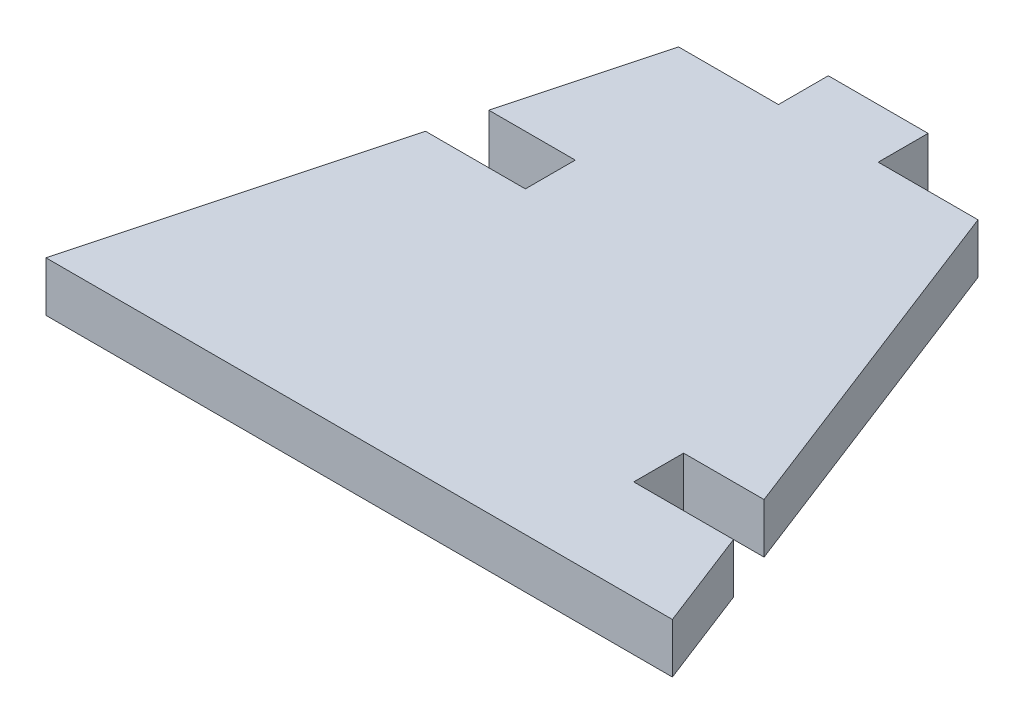
ISO-10303-21;
HEADER;
FILE_DESCRIPTION(('STEP AP214'),'2;1');
FILE_NAME('part.step','',(''),(''),'','','');
FILE_SCHEMA(('AUTOMOTIVE_DESIGN { 1 0 10303 214 1 1 1 1 }'));
ENDSEC;
DATA;
#1=APPLICATION_CONTEXT('core data for automotive mechanical design processes');
#2=APPLICATION_PROTOCOL_DEFINITION('international standard','automotive_design',2000,#1);
#3=PRODUCT_CONTEXT('',#1,'mechanical');
#4=PRODUCT('Part','Part','',(#3));
#5=PRODUCT_RELATED_PRODUCT_CATEGORY('part','',(#4));
#6=PRODUCT_DEFINITION_FORMATION('','',#4);
#7=PRODUCT_DEFINITION_CONTEXT('part definition',#1,'design');
#8=PRODUCT_DEFINITION('design','',#6,#7);
#9=PRODUCT_DEFINITION_SHAPE('','',#8);
#10=(LENGTH_UNIT() NAMED_UNIT(*) SI_UNIT(.MILLI.,.METRE.));
#11=(NAMED_UNIT(*) PLANE_ANGLE_UNIT() SI_UNIT($,.RADIAN.));
#12=(NAMED_UNIT(*) SI_UNIT($,.STERADIAN.) SOLID_ANGLE_UNIT());
#13=UNCERTAINTY_MEASURE_WITH_UNIT(LENGTH_MEASURE(1.E-05),#10,'distance_accuracy_value','');
#14=(GEOMETRIC_REPRESENTATION_CONTEXT(3) GLOBAL_UNCERTAINTY_ASSIGNED_CONTEXT((#13)) GLOBAL_UNIT_ASSIGNED_CONTEXT((#10,
#11,#12)) REPRESENTATION_CONTEXT('',''));
#15=CARTESIAN_POINT('',(0.,0.,0.));
#16=DIRECTION('',(0.,0.,1.));
#17=DIRECTION('',(1.,0.,0.));
#18=AXIS2_PLACEMENT_3D('',#15,#16,#17);
#19=CARTESIAN_POINT('',(0.,10.,0.));
#20=DIRECTION('',(0.,0.,-1.));
#21=DIRECTION('',(-1.,0.,0.));
#22=AXIS2_PLACEMENT_3D('',#19,#20,#21);
#23=PLANE('',#22);
#24=DIRECTION('',(1.,0.,0.));
#25=VECTOR('',#24,1.);
#26=CARTESIAN_POINT('',(0.,0.,0.));
#27=LINE('',#26,#25);
#28=CARTESIAN_POINT('',(-38.0304678026323,0.,0.));
#29=VERTEX_POINT('',#28);
#30=CARTESIAN_POINT('',(87.5130602427564,0.,0.));
#31=VERTEX_POINT('',#30);
#32=EDGE_CURVE('E112',#29,#31,#27,.T.);
#33=ORIENTED_EDGE('',*,*,#32,.T.);
#34=DIRECTION('',(0.,-1.,0.));
#35=VECTOR('',#34,1.);
#36=CARTESIAN_POINT('',(87.5130602427564,10.,0.));
#37=LINE('',#36,#35);
#38=CARTESIAN_POINT('',(87.5130602427564,10.,0.));
#39=VERTEX_POINT('',#38);
#40=EDGE_CURVE('E11',#39,#31,#37,.T.);
#41=ORIENTED_EDGE('',*,*,#40,.F.);
#42=DIRECTION('',(1.,0.,0.));
#43=VECTOR('',#42,1.);
#44=CARTESIAN_POINT('',(-38.0304678026323,10.,0.));
#45=LINE('',#44,#43);
#46=CARTESIAN_POINT('',(-38.0304678026323,10.,0.));
#47=VERTEX_POINT('',#46);
#48=EDGE_CURVE('E118',#47,#39,#45,.T.);
#49=ORIENTED_EDGE('',*,*,#48,.F.);
#50=DIRECTION('',(0.,-1.,0.));
#51=VECTOR('',#50,1.);
#52=CARTESIAN_POINT('',(-38.0304678026323,10.,0.));
#53=LINE('',#52,#51);
#54=EDGE_CURVE('E176',#47,#29,#53,.T.);
#55=ORIENTED_EDGE('',*,*,#54,.T.);
#56=EDGE_LOOP('',(#33,#41,#49,#55));
#57=FACE_BOUND('',#56,.T.);
#58=ADVANCED_FACE('F36',(#57),#23,.F.);
#59=CARTESIAN_POINT('',(87.5130602427564,10.,0.));
#60=DIRECTION('',(-0.932445835577262,0.,0.361309789120946));
#61=DIRECTION('',(0.361309789120946,0.,0.932445835577262));
#62=AXIS2_PLACEMENT_3D('',#59,#60,#61);
#63=PLANE('',#62);
#64=DIRECTION('',(-0.361309789120946,0.,-0.932445835577262));
#65=VECTOR('',#64,1.);
#66=CARTESIAN_POINT('',(87.5130602427564,0.,0.));
#67=LINE('',#66,#65);
#68=CARTESIAN_POINT('',(79.7633384823012,0.,-20.));
#69=VERTEX_POINT('',#68);
#70=EDGE_CURVE('E181',#31,#69,#67,.T.);
#71=ORIENTED_EDGE('',*,*,#70,.T.);
#72=DIRECTION('',(0.,-1.,0.));
#73=VECTOR('',#72,1.);
#74=CARTESIAN_POINT('',(79.7633384823012,10.,-20.));
#75=LINE('',#74,#73);
#76=CARTESIAN_POINT('',(79.7633384823012,10.,-20.));
#77=VERTEX_POINT('',#76);
#78=EDGE_CURVE('E44',#77,#69,#75,.T.);
#79=ORIENTED_EDGE('',*,*,#78,.F.);
#80=DIRECTION('',(-0.361309789120946,0.,-0.932445835577262));
#81=VECTOR('',#80,1.);
#82=CARTESIAN_POINT('',(87.5130602427564,10.,0.));
#83=LINE('',#82,#81);
#84=EDGE_CURVE('E297',#39,#77,#83,.T.);
#85=ORIENTED_EDGE('',*,*,#84,.F.);
#86=ORIENTED_EDGE('',*,*,#40,.T.);
#87=EDGE_LOOP('',(#71,#79,#85,#86));
#88=FACE_BOUND('',#87,.T.);
#89=ADVANCED_FACE('F300',(#88),#63,.F.);
#90=CARTESIAN_POINT('',(79.7633384823012,10.,-20.));
#91=DIRECTION('',(0.,0.,1.));
#92=DIRECTION('',(1.,0.,0.));
#93=AXIS2_PLACEMENT_3D('',#90,#91,#92);
#94=PLANE('',#93);
#95=DIRECTION('',(-1.,0.,0.));
#96=VECTOR('',#95,1.);
#97=CARTESIAN_POINT('',(79.7633384823012,0.,-20.));
#98=LINE('',#97,#96);
#99=CARTESIAN_POINT('',(59.7633384823012,0.,-20.));
#100=VERTEX_POINT('',#99);
#101=EDGE_CURVE('E183',#69,#100,#98,.T.);
#102=ORIENTED_EDGE('',*,*,#101,.T.);
#103=DIRECTION('',(0.,-1.,0.));
#104=VECTOR('',#103,1.);
#105=CARTESIAN_POINT('',(59.7633384823012,10.,-20.));
#106=LINE('',#105,#104);
#107=CARTESIAN_POINT('',(59.7633384823012,10.,-20.));
#108=VERTEX_POINT('',#107);
#109=EDGE_CURVE('E240',#108,#100,#106,.T.);
#110=ORIENTED_EDGE('',*,*,#109,.F.);
#111=DIRECTION('',(-1.,0.,0.));
#112=VECTOR('',#111,1.);
#113=CARTESIAN_POINT('',(79.7633384823012,10.,-20.));
#114=LINE('',#113,#112);
#115=EDGE_CURVE('E249',#77,#108,#114,.T.);
#116=ORIENTED_EDGE('',*,*,#115,.F.);
#117=ORIENTED_EDGE('',*,*,#78,.T.);
#118=EDGE_LOOP('',(#102,#110,#116,#117));
#119=FACE_BOUND('',#118,.T.);
#120=ADVANCED_FACE('F247',(#119),#94,.F.);
#121=CARTESIAN_POINT('',(59.7633384823012,10.,-20.));
#122=DIRECTION('',(-1.,0.,0.));
#123=DIRECTION('',(0.,0.,1.));
#124=AXIS2_PLACEMENT_3D('',#121,#122,#123);
#125=PLANE('',#124);
#126=DIRECTION('',(0.,0.,-1.));
#127=VECTOR('',#126,1.);
#128=CARTESIAN_POINT('',(59.7633384823012,0.,-20.));
#129=LINE('',#128,#127);
#130=CARTESIAN_POINT('',(59.7633384823012,0.,-30.));
#131=VERTEX_POINT('',#130);
#132=EDGE_CURVE('E185',#100,#131,#129,.T.);
#133=ORIENTED_EDGE('',*,*,#132,.T.);
#134=DIRECTION('',(0.,-1.,0.));
#135=VECTOR('',#134,1.);
#136=CARTESIAN_POINT('',(59.7633384823012,10.,-30.));
#137=LINE('',#136,#135);
#138=CARTESIAN_POINT('',(59.7633384823012,10.,-30.));
#139=VERTEX_POINT('',#138);
#140=EDGE_CURVE('E237',#139,#131,#137,.T.);
#141=ORIENTED_EDGE('',*,*,#140,.F.);
#142=DIRECTION('',(0.,0.,-1.));
#143=VECTOR('',#142,1.);
#144=CARTESIAN_POINT('',(59.7633384823012,10.,-20.));
#145=LINE('',#144,#143);
#146=EDGE_CURVE('E267',#108,#139,#145,.T.);
#147=ORIENTED_EDGE('',*,*,#146,.F.);
#148=ORIENTED_EDGE('',*,*,#109,.T.);
#149=EDGE_LOOP('',(#133,#141,#147,#148));
#150=FACE_BOUND('',#149,.T.);
#151=ADVANCED_FACE('F258',(#150),#125,.F.);
#152=CARTESIAN_POINT('',(59.7633384823012,10.,-30.));
#153=DIRECTION('',(0.,0.,-1.));
#154=DIRECTION('',(-1.,0.,0.));
#155=AXIS2_PLACEMENT_3D('',#152,#153,#154);
#156=PLANE('',#155);
#157=DIRECTION('',(1.,0.,0.));
#158=VECTOR('',#157,1.);
#159=CARTESIAN_POINT('',(59.7633384823012,0.,-30.));
#160=LINE('',#159,#158);
#161=CARTESIAN_POINT('',(75.8884776020736,0.,-30.));
#162=VERTEX_POINT('',#161);
#163=EDGE_CURVE('E187',#131,#162,#160,.T.);
#164=ORIENTED_EDGE('',*,*,#163,.T.);
#165=DIRECTION('',(0.,-1.,0.));
#166=VECTOR('',#165,1.);
#167=CARTESIAN_POINT('',(75.8884776020736,10.,-30.));
#168=LINE('',#167,#166);
#169=CARTESIAN_POINT('',(75.8884776020736,10.,-30.));
#170=VERTEX_POINT('',#169);
#171=EDGE_CURVE('E234',#170,#162,#168,.T.);
#172=ORIENTED_EDGE('',*,*,#171,.F.);
#173=DIRECTION('',(1.,0.,0.));
#174=VECTOR('',#173,1.);
#175=CARTESIAN_POINT('',(59.7633384823012,10.,-30.));
#176=LINE('',#175,#174);
#177=EDGE_CURVE('E264',#139,#170,#176,.T.);
#178=ORIENTED_EDGE('',*,*,#177,.F.);
#179=ORIENTED_EDGE('',*,*,#140,.T.);
#180=EDGE_LOOP('',(#164,#172,#178,#179));
#181=FACE_BOUND('',#180,.T.);
#182=ADVANCED_FACE('F262',(#181),#156,.F.);
#183=CARTESIAN_POINT('',(75.8884776020736,10.,-30.));
#184=DIRECTION('',(-0.932445835577261,0.,0.361309789120947));
#185=DIRECTION('',(0.361309789120947,0.,0.932445835577261));
#186=AXIS2_PLACEMENT_3D('',#183,#184,#185);
#187=PLANE('',#186);
#188=DIRECTION('',(-0.361309789120947,0.,-0.932445835577261));
#189=VECTOR('',#188,1.);
#190=CARTESIAN_POINT('',(75.8884776020736,0.,-30.));
#191=LINE('',#190,#189);
#192=CARTESIAN_POINT('',(48.7644514404804,0.,-100.));
#193=VERTEX_POINT('',#192);
#194=EDGE_CURVE('E189',#162,#193,#191,.T.);
#195=ORIENTED_EDGE('',*,*,#194,.T.);
#196=DIRECTION('',(0.,-1.,0.));
#197=VECTOR('',#196,1.);
#198=CARTESIAN_POINT('',(48.7644514404804,10.,-100.));
#199=LINE('',#198,#197);
#200=CARTESIAN_POINT('',(48.7644514404804,10.,-100.));
#201=VERTEX_POINT('',#200);
#202=EDGE_CURVE('E231',#201,#193,#199,.T.);
#203=ORIENTED_EDGE('',*,*,#202,.F.);
#204=DIRECTION('',(-0.361309789120947,0.,-0.932445835577261));
#205=VECTOR('',#204,1.);
#206=CARTESIAN_POINT('',(75.8884776020736,10.,-30.));
#207=LINE('',#206,#205);
#208=EDGE_CURVE('E266',#170,#201,#207,.T.);
#209=ORIENTED_EDGE('',*,*,#208,.F.);
#210=ORIENTED_EDGE('',*,*,#171,.T.);
#211=EDGE_LOOP('',(#195,#203,#209,#210));
#212=FACE_BOUND('',#211,.T.);
#213=ADVANCED_FACE('F312',(#212),#187,.F.);
#214=CARTESIAN_POINT('',(28.7644514404804,10.,-100.));
#215=DIRECTION('',(0.,0.,1.));
#216=DIRECTION('',(1.,0.,0.));
#217=AXIS2_PLACEMENT_3D('',#214,#215,#216);
#218=PLANE('',#217);
#219=DIRECTION('',(-1.,0.,0.));
#220=VECTOR('',#219,1.);
#221=CARTESIAN_POINT('',(28.7644514404804,0.,-100.));
#222=LINE('',#221,#220);
#223=CARTESIAN_POINT('',(28.7644514404804,0.,-100.));
#224=VERTEX_POINT('',#223);
#225=EDGE_CURVE('E191',#193,#224,#222,.T.);
#226=ORIENTED_EDGE('',*,*,#225,.T.);
#227=DIRECTION('',(0.,-1.,0.));
#228=VECTOR('',#227,1.);
#229=CARTESIAN_POINT('',(28.7644514404804,10.,-100.));
#230=LINE('',#229,#228);
#231=CARTESIAN_POINT('',(28.7644514404804,10.,-100.));
#232=VERTEX_POINT('',#231);
#233=EDGE_CURVE('E228',#232,#224,#230,.T.);
#234=ORIENTED_EDGE('',*,*,#233,.F.);
#235=DIRECTION('',(-1.,0.,0.));
#236=VECTOR('',#235,1.);
#237=CARTESIAN_POINT('',(28.7644514404804,10.,-100.));
#238=LINE('',#237,#236);
#239=EDGE_CURVE('E269',#201,#232,#238,.T.);
#240=ORIENTED_EDGE('',*,*,#239,.F.);
#241=ORIENTED_EDGE('',*,*,#202,.T.);
#242=EDGE_LOOP('',(#226,#234,#240,#241));
#243=FACE_BOUND('',#242,.T.);
#244=ADVANCED_FACE('F315',(#243),#218,.F.);
#245=CARTESIAN_POINT('',(28.7644514404804,10.,-110.));
#246=DIRECTION('',(-1.,0.,0.));
#247=DIRECTION('',(0.,0.,1.));
#248=AXIS2_PLACEMENT_3D('',#245,#246,#247);
#249=PLANE('',#248);
#250=DIRECTION('',(0.,0.,-1.));
#251=VECTOR('',#250,1.);
#252=CARTESIAN_POINT('',(28.7644514404804,0.,-110.));
#253=LINE('',#252,#251);
#254=CARTESIAN_POINT('',(28.7644514404804,0.,-110.));
#255=VERTEX_POINT('',#254);
#256=EDGE_CURVE('E193',#224,#255,#253,.T.);
#257=ORIENTED_EDGE('',*,*,#256,.T.);
#258=DIRECTION('',(0.,-1.,0.));
#259=VECTOR('',#258,1.);
#260=CARTESIAN_POINT('',(28.7644514404804,10.,-110.));
#261=LINE('',#260,#259);
#262=CARTESIAN_POINT('',(28.7644514404804,10.,-110.));
#263=VERTEX_POINT('',#262);
#264=EDGE_CURVE('E225',#263,#255,#261,.T.);
#265=ORIENTED_EDGE('',*,*,#264,.F.);
#266=DIRECTION('',(0.,0.,-1.));
#267=VECTOR('',#266,1.);
#268=CARTESIAN_POINT('',(28.7644514404804,10.,-110.));
#269=LINE('',#268,#267);
#270=EDGE_CURVE('E275',#232,#263,#269,.T.);
#271=ORIENTED_EDGE('',*,*,#270,.F.);
#272=ORIENTED_EDGE('',*,*,#233,.T.);
#273=EDGE_LOOP('',(#257,#265,#271,#272));
#274=FACE_BOUND('',#273,.T.);
#275=ADVANCED_FACE('F319',(#274),#249,.F.);
#276=CARTESIAN_POINT('',(28.7644514404804,10.,-110.));
#277=DIRECTION('',(0.,0.,1.));
#278=DIRECTION('',(1.,0.,0.));
#279=AXIS2_PLACEMENT_3D('',#276,#277,#278);
#280=PLANE('',#279);
#281=DIRECTION('',(-1.,0.,0.));
#282=VECTOR('',#281,1.);
#283=CARTESIAN_POINT('',(28.7644514404804,0.,-110.));
#284=LINE('',#283,#282);
#285=CARTESIAN_POINT('',(8.76445144048042,0.,-110.));
#286=VERTEX_POINT('',#285);
#287=EDGE_CURVE('E195',#255,#286,#284,.T.);
#288=ORIENTED_EDGE('',*,*,#287,.T.);
#289=DIRECTION('',(0.,-1.,0.));
#290=VECTOR('',#289,1.);
#291=CARTESIAN_POINT('',(8.76445144048042,10.,-110.));
#292=LINE('',#291,#290);
#293=CARTESIAN_POINT('',(8.76445144048042,10.,-110.));
#294=VERTEX_POINT('',#293);
#295=EDGE_CURVE('E222',#294,#286,#292,.T.);
#296=ORIENTED_EDGE('',*,*,#295,.F.);
#297=DIRECTION('',(-1.,0.,0.));
#298=VECTOR('',#297,1.);
#299=CARTESIAN_POINT('',(28.7644514404804,10.,-110.));
#300=LINE('',#299,#298);
#301=EDGE_CURVE('E277',#263,#294,#300,.T.);
#302=ORIENTED_EDGE('',*,*,#301,.F.);
#303=ORIENTED_EDGE('',*,*,#264,.T.);
#304=EDGE_LOOP('',(#288,#296,#302,#303));
#305=FACE_BOUND('',#304,.T.);
#306=ADVANCED_FACE('F323',(#305),#280,.F.);
#307=CARTESIAN_POINT('',(8.76445144048042,10.,-110.));
#308=DIRECTION('',(1.,0.,0.));
#309=DIRECTION('',(0.,0.,-1.));
#310=AXIS2_PLACEMENT_3D('',#307,#308,#309);
#311=PLANE('',#310);
#312=DIRECTION('',(0.,0.,1.));
#313=VECTOR('',#312,1.);
#314=CARTESIAN_POINT('',(8.76445144048042,0.,-110.));
#315=LINE('',#314,#313);
#316=CARTESIAN_POINT('',(8.76445144048042,0.,-100.));
#317=VERTEX_POINT('',#316);
#318=EDGE_CURVE('E197',#286,#317,#315,.T.);
#319=ORIENTED_EDGE('',*,*,#318,.T.);
#320=DIRECTION('',(0.,-1.,0.));
#321=VECTOR('',#320,1.);
#322=CARTESIAN_POINT('',(8.76445144048042,10.,-100.));
#323=LINE('',#322,#321);
#324=CARTESIAN_POINT('',(8.76445144048042,10.,-100.));
#325=VERTEX_POINT('',#324);
#326=EDGE_CURVE('E219',#325,#317,#323,.T.);
#327=ORIENTED_EDGE('',*,*,#326,.F.);
#328=DIRECTION('',(0.,0.,1.));
#329=VECTOR('',#328,1.);
#330=CARTESIAN_POINT('',(8.76445144048042,10.,-110.));
#331=LINE('',#330,#329);
#332=EDGE_CURVE('E279',#294,#325,#331,.T.);
#333=ORIENTED_EDGE('',*,*,#332,.F.);
#334=ORIENTED_EDGE('',*,*,#295,.T.);
#335=EDGE_LOOP('',(#319,#327,#333,#334));
#336=FACE_BOUND('',#335,.T.);
#337=ADVANCED_FACE('F327',(#336),#311,.F.);
#338=CARTESIAN_POINT('',(8.76445144048042,10.,-100.));
#339=DIRECTION('',(0.,0.,1.));
#340=DIRECTION('',(1.,0.,0.));
#341=AXIS2_PLACEMENT_3D('',#338,#339,#340);
#342=PLANE('',#341);
#343=DIRECTION('',(-1.,0.,0.));
#344=VECTOR('',#343,1.);
#345=CARTESIAN_POINT('',(8.76445144048042,0.,-100.));
#346=LINE('',#345,#344);
#347=CARTESIAN_POINT('',(-11.2355485595196,0.,-100.));
#348=VERTEX_POINT('',#347);
#349=EDGE_CURVE('E199',#317,#348,#346,.T.);
#350=ORIENTED_EDGE('',*,*,#349,.T.);
#351=DIRECTION('',(0.,-1.,0.));
#352=VECTOR('',#351,1.);
#353=CARTESIAN_POINT('',(-11.2355485595196,10.,-100.));
#354=LINE('',#353,#352);
#355=CARTESIAN_POINT('',(-11.2355485595196,10.,-100.));
#356=VERTEX_POINT('',#355);
#357=EDGE_CURVE('E216',#356,#348,#354,.T.);
#358=ORIENTED_EDGE('',*,*,#357,.F.);
#359=DIRECTION('',(-1.,0.,0.));
#360=VECTOR('',#359,1.);
#361=CARTESIAN_POINT('',(8.76445144048042,10.,-100.));
#362=LINE('',#361,#360);
#363=EDGE_CURVE('E281',#325,#356,#362,.T.);
#364=ORIENTED_EDGE('',*,*,#363,.F.);
#365=ORIENTED_EDGE('',*,*,#326,.T.);
#366=EDGE_LOOP('',(#350,#358,#364,#365));
#367=FACE_BOUND('',#366,.T.);
#368=ADVANCED_FACE('F331',(#367),#342,.F.);
#369=CARTESIAN_POINT('',(-11.2355485595196,10.,-100.));
#370=DIRECTION('',(0.965925826289067,0.,0.258819045102525));
#371=DIRECTION('',(0.258819045102525,0.,-0.965925826289067));
#372=AXIS2_PLACEMENT_3D('',#369,#370,#371);
#373=PLANE('',#372);
#374=DIRECTION('',(-0.258819045102525,0.,0.965925826289067));
#375=VECTOR('',#374,1.);
#376=CARTESIAN_POINT('',(-11.2355485595196,0.,-100.));
#377=LINE('',#376,#375);
#378=CARTESIAN_POINT('',(-19.2740243324534,0.,-70.));
#379=VERTEX_POINT('',#378);
#380=EDGE_CURVE('E201',#348,#379,#377,.T.);
#381=ORIENTED_EDGE('',*,*,#380,.T.);
#382=DIRECTION('',(0.,-1.,0.));
#383=VECTOR('',#382,1.);
#384=CARTESIAN_POINT('',(-19.2740243324534,10.,-70.));
#385=LINE('',#384,#383);
#386=CARTESIAN_POINT('',(-19.2740243324534,10.,-70.));
#387=VERTEX_POINT('',#386);
#388=EDGE_CURVE('E213',#387,#379,#385,.T.);
#389=ORIENTED_EDGE('',*,*,#388,.F.);
#390=DIRECTION('',(-0.258819045102525,0.,0.965925826289067));
#391=VECTOR('',#390,1.);
#392=CARTESIAN_POINT('',(-11.2355485595196,10.,-100.));
#393=LINE('',#392,#391);
#394=EDGE_CURVE('E283',#356,#387,#393,.T.);
#395=ORIENTED_EDGE('',*,*,#394,.F.);
#396=ORIENTED_EDGE('',*,*,#357,.T.);
#397=EDGE_LOOP('',(#381,#389,#395,#396));
#398=FACE_BOUND('',#397,.T.);
#399=ADVANCED_FACE('F289',(#398),#373,.F.);
#400=CARTESIAN_POINT('',(-19.2740243324534,10.,-70.));
#401=DIRECTION('',(0.,0.,-1.));
#402=DIRECTION('',(-1.,0.,0.));
#403=AXIS2_PLACEMENT_3D('',#400,#401,#402);
#404=PLANE('',#403);
#405=DIRECTION('',(1.,0.,0.));
#406=VECTOR('',#405,1.);
#407=CARTESIAN_POINT('',(-19.2740243324534,0.,-70.));
#408=LINE('',#407,#406);
#409=CARTESIAN_POINT('',(-1.95351625676467,0.,-70.));
#410=VERTEX_POINT('',#409);
#411=EDGE_CURVE('E203',#379,#410,#408,.T.);
#412=ORIENTED_EDGE('',*,*,#411,.T.);
#413=DIRECTION('',(0.,-1.,0.));
#414=VECTOR('',#413,1.);
#415=CARTESIAN_POINT('',(-1.95351625676467,10.,-70.));
#416=LINE('',#415,#414);
#417=CARTESIAN_POINT('',(-1.95351625676467,10.,-70.));
#418=VERTEX_POINT('',#417);
#419=EDGE_CURVE('E171',#418,#410,#416,.T.);
#420=ORIENTED_EDGE('',*,*,#419,.F.);
#421=DIRECTION('',(1.,0.,0.));
#422=VECTOR('',#421,1.);
#423=CARTESIAN_POINT('',(-19.2740243324534,10.,-70.));
#424=LINE('',#423,#422);
#425=EDGE_CURVE('E162',#387,#418,#424,.T.);
#426=ORIENTED_EDGE('',*,*,#425,.F.);
#427=ORIENTED_EDGE('',*,*,#388,.T.);
#428=EDGE_LOOP('',(#412,#420,#426,#427));
#429=FACE_BOUND('',#428,.T.);
#430=ADVANCED_FACE('F293',(#429),#404,.F.);
#431=CARTESIAN_POINT('',(-1.95351625676467,10.,-70.));
#432=DIRECTION('',(1.,0.,0.));
#433=DIRECTION('',(0.,0.,-1.));
#434=AXIS2_PLACEMENT_3D('',#431,#432,#433);
#435=PLANE('',#434);
#436=DIRECTION('',(0.,0.,1.));
#437=VECTOR('',#436,1.);
#438=CARTESIAN_POINT('',(-1.95351625676467,0.,-70.));
#439=LINE('',#438,#437);
#440=CARTESIAN_POINT('',(-1.95351625676467,0.,-60.));
#441=VERTEX_POINT('',#440);
#442=EDGE_CURVE('E170',#410,#441,#439,.T.);
#443=ORIENTED_EDGE('',*,*,#442,.T.);
#444=DIRECTION('',(0.,-1.,0.));
#445=VECTOR('',#444,1.);
#446=CARTESIAN_POINT('',(-1.95351625676467,10.,-60.));
#447=LINE('',#446,#445);
#448=CARTESIAN_POINT('',(-1.95351625676467,10.,-60.));
#449=VERTEX_POINT('',#448);
#450=EDGE_CURVE('E167',#449,#441,#447,.T.);
#451=ORIENTED_EDGE('',*,*,#450,.F.);
#452=DIRECTION('',(0.,0.,1.));
#453=VECTOR('',#452,1.);
#454=CARTESIAN_POINT('',(-1.95351625676467,10.,-70.));
#455=LINE('',#454,#453);
#456=EDGE_CURVE('E156',#418,#449,#455,.T.);
#457=ORIENTED_EDGE('',*,*,#456,.F.);
#458=ORIENTED_EDGE('',*,*,#419,.T.);
#459=EDGE_LOOP('',(#443,#451,#457,#458));
#460=FACE_BOUND('',#459,.T.);
#461=ADVANCED_FACE('F168',(#460),#435,.F.);
#462=CARTESIAN_POINT('',(-1.95351625676467,10.,-60.));
#463=DIRECTION('',(0.,0.,1.));
#464=DIRECTION('',(1.,0.,0.));
#465=AXIS2_PLACEMENT_3D('',#462,#463,#464);
#466=PLANE('',#465);
#467=DIRECTION('',(-1.,0.,0.));
#468=VECTOR('',#467,1.);
#469=CARTESIAN_POINT('',(-1.95351625676467,0.,-60.));
#470=LINE('',#469,#468);
#471=CARTESIAN_POINT('',(-21.9535162567647,0.,-60.));
#472=VERTEX_POINT('',#471);
#473=EDGE_CURVE('E105',#441,#472,#470,.T.);
#474=ORIENTED_EDGE('',*,*,#473,.T.);
#475=DIRECTION('',(0.,-1.,0.));
#476=VECTOR('',#475,1.);
#477=CARTESIAN_POINT('',(-21.9535162567647,10.,-60.));
#478=LINE('',#477,#476);
#479=CARTESIAN_POINT('',(-21.9535162567647,10.,-60.));
#480=VERTEX_POINT('',#479);
#481=EDGE_CURVE('E172',#480,#472,#478,.T.);
#482=ORIENTED_EDGE('',*,*,#481,.F.);
#483=DIRECTION('',(-1.,0.,0.));
#484=VECTOR('',#483,1.);
#485=CARTESIAN_POINT('',(-1.95351625676467,10.,-60.));
#486=LINE('',#485,#484);
#487=EDGE_CURVE('E160',#449,#480,#486,.T.);
#488=ORIENTED_EDGE('',*,*,#487,.F.);
#489=ORIENTED_EDGE('',*,*,#450,.T.);
#490=EDGE_LOOP('',(#474,#482,#488,#489));
#491=FACE_BOUND('',#490,.T.);
#492=ADVANCED_FACE('F174',(#491),#466,.F.);
#493=CARTESIAN_POINT('',(-21.9535162567647,10.,-60.));
#494=DIRECTION('',(0.965925826289067,0.,0.258819045102525));
#495=DIRECTION('',(0.258819045102525,0.,-0.965925826289067));
#496=AXIS2_PLACEMENT_3D('',#493,#494,#495);
#497=PLANE('',#496);
#498=DIRECTION('',(-0.258819045102525,0.,0.965925826289067));
#499=VECTOR('',#498,1.);
#500=CARTESIAN_POINT('',(-21.9535162567647,0.,-60.));
#501=LINE('',#500,#499);
#502=EDGE_CURVE('E207',#472,#29,#501,.T.);
#503=ORIENTED_EDGE('',*,*,#502,.T.);
#504=ORIENTED_EDGE('',*,*,#54,.F.);
#505=DIRECTION('',(-0.258819045102525,0.,0.965925826289067));
#506=VECTOR('',#505,1.);
#507=CARTESIAN_POINT('',(-21.9535162567647,10.,-60.));
#508=LINE('',#507,#506);
#509=EDGE_CURVE('E52',#480,#47,#508,.T.);
#510=ORIENTED_EDGE('',*,*,#509,.F.);
#511=ORIENTED_EDGE('',*,*,#481,.T.);
#512=EDGE_LOOP('',(#503,#504,#510,#511));
#513=FACE_BOUND('',#512,.T.);
#514=ADVANCED_FACE('F295',(#513),#497,.F.);
#515=CARTESIAN_POINT('',(0.,10.,0.));
#516=DIRECTION('',(0.,1.,0.));
#517=DIRECTION('',(0.,0.,1.));
#518=AXIS2_PLACEMENT_3D('',#515,#516,#517);
#519=PLANE('',#518);
#520=ORIENTED_EDGE('',*,*,#48,.T.);
#521=ORIENTED_EDGE('',*,*,#84,.T.);
#522=ORIENTED_EDGE('',*,*,#115,.T.);
#523=ORIENTED_EDGE('',*,*,#146,.T.);
#524=ORIENTED_EDGE('',*,*,#177,.T.);
#525=ORIENTED_EDGE('',*,*,#208,.T.);
#526=ORIENTED_EDGE('',*,*,#239,.T.);
#527=ORIENTED_EDGE('',*,*,#270,.T.);
#528=ORIENTED_EDGE('',*,*,#301,.T.);
#529=ORIENTED_EDGE('',*,*,#332,.T.);
#530=ORIENTED_EDGE('',*,*,#363,.T.);
#531=ORIENTED_EDGE('',*,*,#394,.T.);
#532=ORIENTED_EDGE('',*,*,#425,.T.);
#533=ORIENTED_EDGE('',*,*,#456,.T.);
#534=ORIENTED_EDGE('',*,*,#487,.T.);
#535=ORIENTED_EDGE('',*,*,#509,.T.);
#536=EDGE_LOOP('',(#520,#521,#522,#523,#524,#525,#526,#527,#528,#529,#530,#531,#532,#533,#534,#535));
#537=FACE_BOUND('',#536,.T.);
#538=ADVANCED_FACE('F158',(#537),#519,.T.);
#539=CARTESIAN_POINT('',(0.,0.,0.));
#540=DIRECTION('',(0.,1.,0.));
#541=DIRECTION('',(0.,0.,1.));
#542=AXIS2_PLACEMENT_3D('',#539,#540,#541);
#543=PLANE('',#542);
#544=ORIENTED_EDGE('',*,*,#32,.F.);
#545=ORIENTED_EDGE('',*,*,#502,.F.);
#546=ORIENTED_EDGE('',*,*,#473,.F.);
#547=ORIENTED_EDGE('',*,*,#442,.F.);
#548=ORIENTED_EDGE('',*,*,#411,.F.);
#549=ORIENTED_EDGE('',*,*,#380,.F.);
#550=ORIENTED_EDGE('',*,*,#349,.F.);
#551=ORIENTED_EDGE('',*,*,#318,.F.);
#552=ORIENTED_EDGE('',*,*,#287,.F.);
#553=ORIENTED_EDGE('',*,*,#256,.F.);
#554=ORIENTED_EDGE('',*,*,#225,.F.);
#555=ORIENTED_EDGE('',*,*,#194,.F.);
#556=ORIENTED_EDGE('',*,*,#163,.F.);
#557=ORIENTED_EDGE('',*,*,#132,.F.);
#558=ORIENTED_EDGE('',*,*,#101,.F.);
#559=ORIENTED_EDGE('',*,*,#70,.F.);
#560=EDGE_LOOP('',(#544,#545,#546,#547,#548,#549,#550,#551,#552,#553,#554,#555,#556,#557,#558,#559));
#561=FACE_BOUND('',#560,.T.);
#562=ADVANCED_FACE('F253',(#561),#543,.F.);
#563=CLOSED_SHELL('',(#58,#89,#120,#151,#182,#213,#244,#275,#306,#337,#368,#399,#430,#461,#492,
#514,#538,#562));
#564=MANIFOLD_SOLID_BREP('B2',#563);
#565=ADVANCED_BREP_SHAPE_REPRESENTATION('',(#18,#564),#14);
#566=SHAPE_DEFINITION_REPRESENTATION(#9,#565);
ENDSEC;
END-ISO-10303-21;
